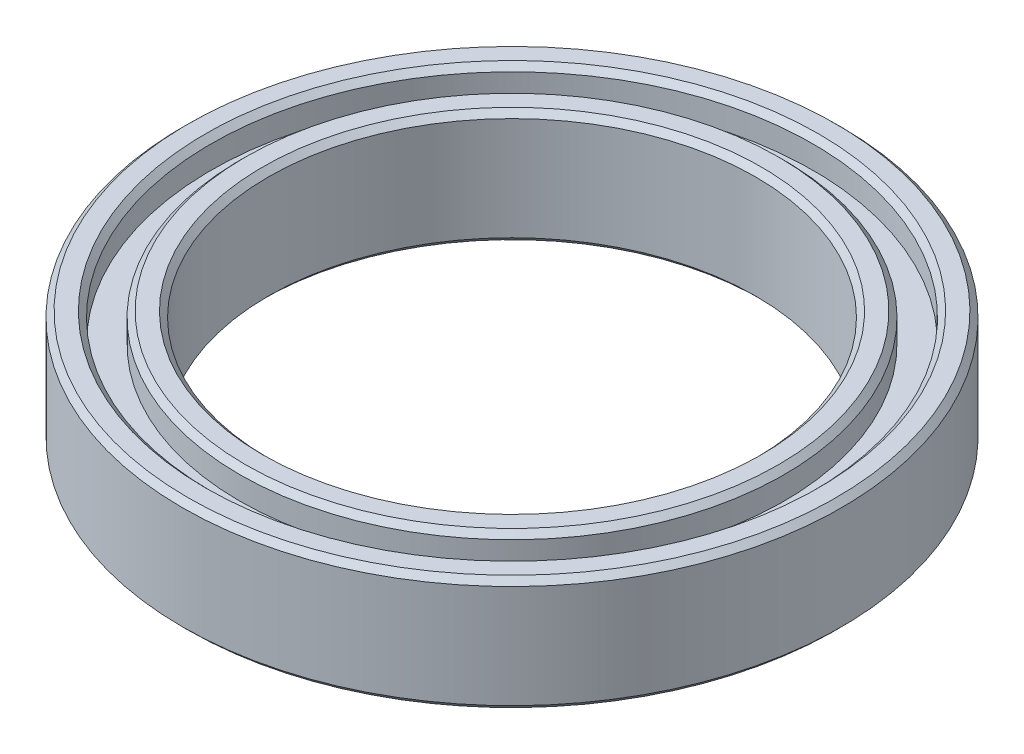
ISO-10303-21;
HEADER;
FILE_DESCRIPTION(('STEP AP214'),'2;1');
FILE_NAME('part.step','',(''),(''),'','','');
FILE_SCHEMA(('AUTOMOTIVE_DESIGN { 1 0 10303 214 1 1 1 1 }'));
ENDSEC;
DATA;
#1=APPLICATION_CONTEXT('core data for automotive mechanical design processes');
#2=APPLICATION_PROTOCOL_DEFINITION('international standard','automotive_design',2000,#1);
#3=PRODUCT_CONTEXT('',#1,'mechanical');
#4=PRODUCT('Part','Part','',(#3));
#5=PRODUCT_RELATED_PRODUCT_CATEGORY('part','',(#4));
#6=PRODUCT_DEFINITION_FORMATION('','',#4);
#7=PRODUCT_DEFINITION_CONTEXT('part definition',#1,'design');
#8=PRODUCT_DEFINITION('design','',#6,#7);
#9=PRODUCT_DEFINITION_SHAPE('','',#8);
#10=(LENGTH_UNIT() NAMED_UNIT(*) SI_UNIT(.MILLI.,.METRE.));
#11=(NAMED_UNIT(*) PLANE_ANGLE_UNIT() SI_UNIT($,.RADIAN.));
#12=(NAMED_UNIT(*) SI_UNIT($,.STERADIAN.) SOLID_ANGLE_UNIT());
#13=UNCERTAINTY_MEASURE_WITH_UNIT(LENGTH_MEASURE(1.E-05),#10,'distance_accuracy_value','');
#14=(GEOMETRIC_REPRESENTATION_CONTEXT(3) GLOBAL_UNCERTAINTY_ASSIGNED_CONTEXT((#13)) GLOBAL_UNIT_ASSIGNED_CONTEXT((#10,
#11,#12)) REPRESENTATION_CONTEXT('',''));
#15=CARTESIAN_POINT('',(0.,0.,0.));
#16=DIRECTION('',(0.,0.,1.));
#17=DIRECTION('',(1.,0.,0.));
#18=AXIS2_PLACEMENT_3D('',#15,#16,#17);
#19=CARTESIAN_POINT('',(0.,0.,0.));
#20=DIRECTION('',(0.,1.,0.));
#21=DIRECTION('',(0.,0.,1.));
#22=AXIS2_PLACEMENT_3D('',#19,#20,#21);
#23=PLANE('',#22);
#24=CARTESIAN_POINT('',(0.,0.,0.));
#25=DIRECTION('',(0.,1.,0.));
#26=DIRECTION('',(0.,0.,1.));
#27=AXIS2_PLACEMENT_3D('',#24,#25,#26);
#28=CIRCLE('',#27,9.3);
#29=CARTESIAN_POINT('',(0.,0.,9.3));
#30=VERTEX_POINT('',#29);
#31=EDGE_CURVE('E55',#30,#30,#28,.F.);
#32=ORIENTED_EDGE('',*,*,#31,.T.);
#33=EDGE_LOOP('',(#32));
#34=FACE_BOUND('',#33,.T.);
#35=CARTESIAN_POINT('',(0.,0.,0.));
#36=DIRECTION('',(0.,1.,0.));
#37=DIRECTION('',(0.,0.,1.));
#38=AXIS2_PLACEMENT_3D('',#35,#36,#37);
#39=CIRCLE('',#38,8.7);
#40=CARTESIAN_POINT('',(0.,0.,8.7));
#41=VERTEX_POINT('',#40);
#42=EDGE_CURVE('E59',#41,#41,#39,.T.);
#43=ORIENTED_EDGE('',*,*,#42,.T.);
#44=EDGE_LOOP('',(#43));
#45=FACE_BOUND('',#44,.T.);
#46=ADVANCED_FACE('F47',(#34,#45),#23,.F.);
#47=CARTESIAN_POINT('',(0.,4.,0.));
#48=DIRECTION('',(0.,1.,0.));
#49=DIRECTION('',(0.,0.,1.));
#50=AXIS2_PLACEMENT_3D('',#47,#48,#49);
#51=PLANE('',#50);
#52=CARTESIAN_POINT('',(0.,4.,0.));
#53=DIRECTION('',(0.,1.,0.));
#54=DIRECTION('',(0.,0.,1.));
#55=AXIS2_PLACEMENT_3D('',#52,#53,#54);
#56=CIRCLE('',#55,9.3);
#57=CARTESIAN_POINT('',(0.,4.,9.3));
#58=VERTEX_POINT('',#57);
#59=EDGE_CURVE('E98',#58,#58,#56,.T.);
#60=ORIENTED_EDGE('',*,*,#59,.T.);
#61=EDGE_LOOP('',(#60));
#62=FACE_BOUND('',#61,.T.);
#63=CARTESIAN_POINT('',(0.,4.,0.));
#64=DIRECTION('',(0.,1.,0.));
#65=DIRECTION('',(0.,0.,1.));
#66=AXIS2_PLACEMENT_3D('',#63,#64,#65);
#67=CIRCLE('',#66,8.7);
#68=CARTESIAN_POINT('',(0.,4.,8.7));
#69=VERTEX_POINT('',#68);
#70=EDGE_CURVE('E101',#69,#69,#67,.F.);
#71=ORIENTED_EDGE('',*,*,#70,.T.);
#72=EDGE_LOOP('',(#71));
#73=FACE_BOUND('',#72,.T.);
#74=ADVANCED_FACE('F138',(#62,#73),#51,.T.);
#75=CARTESIAN_POINT('',(0.,4.,0.));
#76=DIRECTION('',(0.,1.,0.));
#77=DIRECTION('',(0.,0.,1.));
#78=AXIS2_PLACEMENT_3D('',#75,#76,#77);
#79=CIRCLE('',#78,11.3);
#80=CARTESIAN_POINT('',(0.,4.,11.3));
#81=VERTEX_POINT('',#80);
#82=EDGE_CURVE('E83',#81,#81,#79,.T.);
#83=ORIENTED_EDGE('',*,*,#82,.T.);
#84=EDGE_LOOP('',(#83));
#85=FACE_BOUND('',#84,.T.);
#86=CARTESIAN_POINT('',(0.,4.,0.));
#87=DIRECTION('',(0.,1.,0.));
#88=DIRECTION('',(0.,0.,1.));
#89=AXIS2_PLACEMENT_3D('',#86,#87,#88);
#90=CIRCLE('',#89,10.7);
#91=CARTESIAN_POINT('',(0.,4.,10.7));
#92=VERTEX_POINT('',#91);
#93=EDGE_CURVE('E86',#92,#92,#90,.F.);
#94=ORIENTED_EDGE('',*,*,#93,.T.);
#95=EDGE_LOOP('',(#94));
#96=FACE_BOUND('',#95,.T.);
#97=ADVANCED_FACE('F144',(#85,#96),#51,.T.);
#98=CARTESIAN_POINT('',(0.,0.,0.));
#99=DIRECTION('',(0.,1.,0.));
#100=DIRECTION('',(0.,0.,1.));
#101=AXIS2_PLACEMENT_3D('',#98,#99,#100);
#102=CIRCLE('',#101,11.3);
#103=CARTESIAN_POINT('',(0.,0.,11.3));
#104=VERTEX_POINT('',#103);
#105=EDGE_CURVE('E68',#104,#104,#102,.F.);
#106=ORIENTED_EDGE('',*,*,#105,.T.);
#107=EDGE_LOOP('',(#106));
#108=FACE_BOUND('',#107,.T.);
#109=CARTESIAN_POINT('',(0.,0.,0.));
#110=DIRECTION('',(0.,1.,0.));
#111=DIRECTION('',(0.,0.,1.));
#112=AXIS2_PLACEMENT_3D('',#109,#110,#111);
#113=CIRCLE('',#112,10.7);
#114=CARTESIAN_POINT('',(0.,0.,10.7));
#115=VERTEX_POINT('',#114);
#116=EDGE_CURVE('E71',#115,#115,#113,.T.);
#117=ORIENTED_EDGE('',*,*,#116,.T.);
#118=EDGE_LOOP('',(#117));
#119=FACE_BOUND('',#118,.T.);
#120=ADVANCED_FACE('F140',(#108,#119),#23,.F.);
#121=CARTESIAN_POINT('',(0.,4.,0.));
#122=DIRECTION('',(0.,-1.,0.));
#123=DIRECTION('',(0.,0.,-1.));
#124=AXIS2_PLACEMENT_3D('',#121,#122,#123);
#125=CYLINDRICAL_SURFACE('',#124,11.5);
#126=CARTESIAN_POINT('',(0.,3.8,0.));
#127=DIRECTION('',(0.,1.,0.));
#128=DIRECTION('',(0.,0.,1.));
#129=AXIS2_PLACEMENT_3D('',#126,#127,#128);
#130=CIRCLE('',#129,11.5);
#131=CARTESIAN_POINT('',(0.,3.8,11.5));
#132=VERTEX_POINT('',#131);
#133=EDGE_CURVE('E77',#132,#132,#130,.F.);
#134=ORIENTED_EDGE('',*,*,#133,.T.);
#135=EDGE_LOOP('',(#134));
#136=FACE_BOUND('',#135,.T.);
#137=CARTESIAN_POINT('',(0.,0.200000000000002,0.));
#138=DIRECTION('',(0.,1.,0.));
#139=DIRECTION('',(0.,0.,1.));
#140=AXIS2_PLACEMENT_3D('',#137,#138,#139);
#141=CIRCLE('',#140,11.5);
#142=CARTESIAN_POINT('',(0.,0.200000000000002,11.5));
#143=VERTEX_POINT('',#142);
#144=EDGE_CURVE('E80',#143,#143,#141,.T.);
#145=ORIENTED_EDGE('',*,*,#144,.T.);
#146=EDGE_LOOP('',(#145));
#147=FACE_BOUND('',#146,.T.);
#148=ADVANCED_FACE('F150',(#136,#147),#125,.T.);
#149=CARTESIAN_POINT('',(0.,4.,0.));
#150=DIRECTION('',(0.,-1.,0.));
#151=DIRECTION('',(0.,0.,-1.));
#152=AXIS2_PLACEMENT_3D('',#149,#150,#151);
#153=CYLINDRICAL_SURFACE('',#152,8.5);
#154=CARTESIAN_POINT('',(0.,3.8,0.));
#155=DIRECTION('',(0.,1.,0.));
#156=DIRECTION('',(0.,0.,1.));
#157=AXIS2_PLACEMENT_3D('',#154,#155,#156);
#158=CIRCLE('',#157,8.5);
#159=CARTESIAN_POINT('',(0.,3.8,8.5));
#160=VERTEX_POINT('',#159);
#161=EDGE_CURVE('E89',#160,#160,#158,.T.);
#162=ORIENTED_EDGE('',*,*,#161,.T.);
#163=EDGE_LOOP('',(#162));
#164=FACE_BOUND('',#163,.T.);
#165=CARTESIAN_POINT('',(0.,0.199999999999999,0.));
#166=DIRECTION('',(0.,1.,0.));
#167=DIRECTION('',(0.,0.,1.));
#168=AXIS2_PLACEMENT_3D('',#165,#166,#167);
#169=CIRCLE('',#168,8.5);
#170=CARTESIAN_POINT('',(0.,0.199999999999999,8.5));
#171=VERTEX_POINT('',#170);
#172=EDGE_CURVE('E92',#171,#171,#169,.F.);
#173=ORIENTED_EDGE('',*,*,#172,.T.);
#174=EDGE_LOOP('',(#173));
#175=FACE_BOUND('',#174,.T.);
#176=ADVANCED_FACE('F156',(#164,#175),#153,.F.);
#177=CARTESIAN_POINT('',(0.,3.,0.));
#178=DIRECTION('',(0.,1.,0.));
#179=DIRECTION('',(0.,0.,1.));
#180=AXIS2_PLACEMENT_3D('',#177,#178,#179);
#181=CYLINDRICAL_SURFACE('',#180,10.5);
#182=CARTESIAN_POINT('',(0.,3.8,0.));
#183=DIRECTION('',(0.,1.,0.));
#184=DIRECTION('',(0.,0.,1.));
#185=AXIS2_PLACEMENT_3D('',#182,#183,#184);
#186=CIRCLE('',#185,10.5);
#187=CARTESIAN_POINT('',(0.,3.8,10.5));
#188=VERTEX_POINT('',#187);
#189=EDGE_CURVE('E74',#188,#188,#186,.T.);
#190=ORIENTED_EDGE('',*,*,#189,.T.);
#191=EDGE_LOOP('',(#190));
#192=FACE_BOUND('',#191,.T.);
#193=CARTESIAN_POINT('',(0.,3.,0.));
#194=DIRECTION('',(0.,1.,0.));
#195=DIRECTION('',(0.,0.,1.));
#196=AXIS2_PLACEMENT_3D('',#193,#194,#195);
#197=CIRCLE('',#196,10.5);
#198=CARTESIAN_POINT('',(0.,3.,10.5));
#199=VERTEX_POINT('',#198);
#200=EDGE_CURVE('E104',#199,#199,#197,.T.);
#201=ORIENTED_EDGE('',*,*,#200,.F.);
#202=EDGE_LOOP('',(#201));
#203=FACE_BOUND('',#202,.T.);
#204=ADVANCED_FACE('F229',(#192,#203),#181,.F.);
#205=CARTESIAN_POINT('',(0.,3.,0.));
#206=DIRECTION('',(0.,1.,0.));
#207=DIRECTION('',(0.,0.,1.));
#208=AXIS2_PLACEMENT_3D('',#205,#206,#207);
#209=PLANE('',#208);
#210=CARTESIAN_POINT('',(0.,3.,0.));
#211=DIRECTION('',(0.,1.,0.));
#212=DIRECTION('',(0.,0.,1.));
#213=AXIS2_PLACEMENT_3D('',#210,#211,#212);
#214=CIRCLE('',#213,9.5);
#215=CARTESIAN_POINT('',(0.,3.,9.5));
#216=VERTEX_POINT('',#215);
#217=EDGE_CURVE('E107',#216,#216,#214,.T.);
#218=ORIENTED_EDGE('',*,*,#217,.F.);
#219=EDGE_LOOP('',(#218));
#220=FACE_BOUND('',#219,.T.);
#221=ORIENTED_EDGE('',*,*,#200,.T.);
#222=EDGE_LOOP('',(#221));
#223=FACE_BOUND('',#222,.T.);
#224=ADVANCED_FACE('F134',(#220,#223),#209,.T.);
#225=CARTESIAN_POINT('',(0.,3.,0.));
#226=DIRECTION('',(0.,1.,0.));
#227=DIRECTION('',(0.,0.,1.));
#228=AXIS2_PLACEMENT_3D('',#225,#226,#227);
#229=CYLINDRICAL_SURFACE('',#228,9.5);
#230=CARTESIAN_POINT('',(0.,3.8,0.));
#231=DIRECTION('',(0.,1.,0.));
#232=DIRECTION('',(0.,0.,1.));
#233=AXIS2_PLACEMENT_3D('',#230,#231,#232);
#234=CIRCLE('',#233,9.5);
#235=CARTESIAN_POINT('',(0.,3.8,9.5));
#236=VERTEX_POINT('',#235);
#237=EDGE_CURVE('E95',#236,#236,#234,.F.);
#238=ORIENTED_EDGE('',*,*,#237,.T.);
#239=EDGE_LOOP('',(#238));
#240=FACE_BOUND('',#239,.T.);
#241=ORIENTED_EDGE('',*,*,#217,.T.);
#242=EDGE_LOOP('',(#241));
#243=FACE_BOUND('',#242,.T.);
#244=ADVANCED_FACE('F127',(#240,#243),#229,.T.);
#245=CARTESIAN_POINT('',(0.,1.,0.));
#246=DIRECTION('',(0.,-1.,0.));
#247=DIRECTION('',(0.,0.,-1.));
#248=AXIS2_PLACEMENT_3D('',#245,#246,#247);
#249=CYLINDRICAL_SURFACE('',#248,10.5);
#250=CARTESIAN_POINT('',(0.,0.200000000000001,0.));
#251=DIRECTION('',(0.,1.,0.));
#252=DIRECTION('',(0.,0.,1.));
#253=AXIS2_PLACEMENT_3D('',#250,#251,#252);
#254=CIRCLE('',#253,10.5);
#255=CARTESIAN_POINT('',(0.,0.200000000000001,10.5));
#256=VERTEX_POINT('',#255);
#257=EDGE_CURVE('E63',#256,#256,#254,.F.);
#258=ORIENTED_EDGE('',*,*,#257,.T.);
#259=EDGE_LOOP('',(#258));
#260=FACE_BOUND('',#259,.T.);
#261=CARTESIAN_POINT('',(0.,1.,0.));
#262=DIRECTION('',(0.,-1.,0.));
#263=DIRECTION('',(0.,0.,-1.));
#264=AXIS2_PLACEMENT_3D('',#261,#262,#263);
#265=CIRCLE('',#264,10.5);
#266=CARTESIAN_POINT('',(0.,1.,-10.5));
#267=VERTEX_POINT('',#266);
#268=EDGE_CURVE('E110',#267,#267,#265,.T.);
#269=ORIENTED_EDGE('',*,*,#268,.F.);
#270=EDGE_LOOP('',(#269));
#271=FACE_BOUND('',#270,.T.);
#272=ADVANCED_FACE('F122',(#260,#271),#249,.F.);
#273=CARTESIAN_POINT('',(0.,1.,0.));
#274=DIRECTION('',(0.,-1.,0.));
#275=DIRECTION('',(0.,0.,-1.));
#276=AXIS2_PLACEMENT_3D('',#273,#274,#275);
#277=PLANE('',#276);
#278=CARTESIAN_POINT('',(0.,1.,0.));
#279=DIRECTION('',(0.,-1.,0.));
#280=DIRECTION('',(0.,0.,-1.));
#281=AXIS2_PLACEMENT_3D('',#278,#279,#280);
#282=CIRCLE('',#281,9.5);
#283=CARTESIAN_POINT('',(0.,1.,-9.5));
#284=VERTEX_POINT('',#283);
#285=EDGE_CURVE('E113',#284,#284,#282,.T.);
#286=ORIENTED_EDGE('',*,*,#285,.F.);
#287=EDGE_LOOP('',(#286));
#288=FACE_BOUND('',#287,.T.);
#289=ORIENTED_EDGE('',*,*,#268,.T.);
#290=EDGE_LOOP('',(#289));
#291=FACE_BOUND('',#290,.T.);
#292=ADVANCED_FACE('F119',(#288,#291),#277,.T.);
#293=CARTESIAN_POINT('',(0.,1.,0.));
#294=DIRECTION('',(0.,-1.,0.));
#295=DIRECTION('',(0.,0.,-1.));
#296=AXIS2_PLACEMENT_3D('',#293,#294,#295);
#297=CYLINDRICAL_SURFACE('',#296,9.5);
#298=CARTESIAN_POINT('',(0.,0.199999999999999,0.));
#299=DIRECTION('',(0.,1.,0.));
#300=DIRECTION('',(0.,0.,1.));
#301=AXIS2_PLACEMENT_3D('',#298,#299,#300);
#302=CIRCLE('',#301,9.5);
#303=CARTESIAN_POINT('',(0.,0.199999999999999,9.5));
#304=VERTEX_POINT('',#303);
#305=EDGE_CURVE('E10',#304,#304,#302,.T.);
#306=ORIENTED_EDGE('',*,*,#305,.T.);
#307=EDGE_LOOP('',(#306));
#308=FACE_BOUND('',#307,.T.);
#309=ORIENTED_EDGE('',*,*,#285,.T.);
#310=EDGE_LOOP('',(#309));
#311=FACE_BOUND('',#310,.T.);
#312=ADVANCED_FACE('F117',(#308,#311),#297,.T.);
#313=CARTESIAN_POINT('',(0.,4.,0.));
#314=DIRECTION('',(0.,-1.,0.));
#315=DIRECTION('',(0.,0.,-1.));
#316=AXIS2_PLACEMENT_3D('',#313,#314,#315);
#317=CONICAL_SURFACE('',#316,9.3,0.785398163397453);
#318=ORIENTED_EDGE('',*,*,#237,.F.);
#319=EDGE_LOOP('',(#318));
#320=FACE_BOUND('',#319,.T.);
#321=ORIENTED_EDGE('',*,*,#59,.F.);
#322=EDGE_LOOP('',(#321));
#323=FACE_BOUND('',#322,.T.);
#324=ADVANCED_FACE('F210',(#320,#323),#317,.T.);
#325=CARTESIAN_POINT('',(0.,3.8,0.));
#326=DIRECTION('',(0.,1.,0.));
#327=DIRECTION('',(0.,0.,1.));
#328=AXIS2_PLACEMENT_3D('',#325,#326,#327);
#329=CONICAL_SURFACE('',#328,8.5,0.785398163397466);
#330=ORIENTED_EDGE('',*,*,#70,.F.);
#331=EDGE_LOOP('',(#330));
#332=FACE_BOUND('',#331,.T.);
#333=ORIENTED_EDGE('',*,*,#161,.F.);
#334=EDGE_LOOP('',(#333));
#335=FACE_BOUND('',#334,.T.);
#336=ADVANCED_FACE('F203',(#332,#335),#329,.F.);
#337=CARTESIAN_POINT('',(0.,4.,0.));
#338=DIRECTION('',(0.,-1.,0.));
#339=DIRECTION('',(0.,0.,-1.));
#340=AXIS2_PLACEMENT_3D('',#337,#338,#339);
#341=CONICAL_SURFACE('',#340,11.3,0.785398163397453);
#342=ORIENTED_EDGE('',*,*,#133,.F.);
#343=EDGE_LOOP('',(#342));
#344=FACE_BOUND('',#343,.T.);
#345=ORIENTED_EDGE('',*,*,#82,.F.);
#346=EDGE_LOOP('',(#345));
#347=FACE_BOUND('',#346,.T.);
#348=ADVANCED_FACE('F196',(#344,#347),#341,.T.);
#349=CARTESIAN_POINT('',(0.,3.8,0.));
#350=DIRECTION('',(0.,1.,0.));
#351=DIRECTION('',(0.,0.,1.));
#352=AXIS2_PLACEMENT_3D('',#349,#350,#351);
#353=CONICAL_SURFACE('',#352,10.5,0.785398163397448);
#354=ORIENTED_EDGE('',*,*,#93,.F.);
#355=EDGE_LOOP('',(#354));
#356=FACE_BOUND('',#355,.T.);
#357=ORIENTED_EDGE('',*,*,#189,.F.);
#358=EDGE_LOOP('',(#357));
#359=FACE_BOUND('',#358,.T.);
#360=ADVANCED_FACE('F175',(#356,#359),#353,.F.);
#361=CARTESIAN_POINT('',(0.,0.200000000000002,0.));
#362=DIRECTION('',(0.,1.,0.));
#363=DIRECTION('',(0.,0.,1.));
#364=AXIS2_PLACEMENT_3D('',#361,#362,#363);
#365=CONICAL_SURFACE('',#364,11.5,0.785398163397448);
#366=ORIENTED_EDGE('',*,*,#105,.F.);
#367=EDGE_LOOP('',(#366));
#368=FACE_BOUND('',#367,.T.);
#369=ORIENTED_EDGE('',*,*,#144,.F.);
#370=EDGE_LOOP('',(#369));
#371=FACE_BOUND('',#370,.T.);
#372=ADVANCED_FACE('F167',(#368,#371),#365,.T.);
#373=CARTESIAN_POINT('',(0.,0.200000000000001,0.));
#374=DIRECTION('',(0.,-1.,0.));
#375=DIRECTION('',(0.,0.,-1.));
#376=AXIS2_PLACEMENT_3D('',#373,#374,#375);
#377=CONICAL_SURFACE('',#376,10.5,0.785398163397457);
#378=ORIENTED_EDGE('',*,*,#116,.F.);
#379=EDGE_LOOP('',(#378));
#380=FACE_BOUND('',#379,.T.);
#381=ORIENTED_EDGE('',*,*,#257,.F.);
#382=EDGE_LOOP('',(#381));
#383=FACE_BOUND('',#382,.T.);
#384=ADVANCED_FACE('F163',(#380,#383),#377,.F.);
#385=CARTESIAN_POINT('',(0.,0.,0.));
#386=DIRECTION('',(0.,1.,0.));
#387=DIRECTION('',(0.,0.,1.));
#388=AXIS2_PLACEMENT_3D('',#385,#386,#387);
#389=CONICAL_SURFACE('',#388,9.3,0.785398163397453);
#390=ORIENTED_EDGE('',*,*,#305,.F.);
#391=EDGE_LOOP('',(#390));
#392=FACE_BOUND('',#391,.T.);
#393=ORIENTED_EDGE('',*,*,#31,.F.);
#394=EDGE_LOOP('',(#393));
#395=FACE_BOUND('',#394,.T.);
#396=ADVANCED_FACE('F166',(#392,#395),#389,.T.);
#397=CARTESIAN_POINT('',(0.,0.,0.));
#398=DIRECTION('',(0.,-1.,0.));
#399=DIRECTION('',(0.,0.,-1.));
#400=AXIS2_PLACEMENT_3D('',#397,#398,#399);
#401=CONICAL_SURFACE('',#400,8.7,0.785398163397448);
#402=ORIENTED_EDGE('',*,*,#172,.F.);
#403=EDGE_LOOP('',(#402));
#404=FACE_BOUND('',#403,.T.);
#405=ORIENTED_EDGE('',*,*,#42,.F.);
#406=EDGE_LOOP('',(#405));
#407=FACE_BOUND('',#406,.T.);
#408=ADVANCED_FACE('F50',(#404,#407),#401,.F.);
#409=CLOSED_SHELL('',(#46,#74,#97,#120,#148,#176,#204,#224,#244,#272,#292,#312,#324,#336,#348,
#360,#372,#384,#396,#408));
#410=MANIFOLD_SOLID_BREP('B2',#409);
#411=ADVANCED_BREP_SHAPE_REPRESENTATION('',(#18,#410),#14);
#412=SHAPE_DEFINITION_REPRESENTATION(#9,#411);
ENDSEC;
END-ISO-10303-21;
